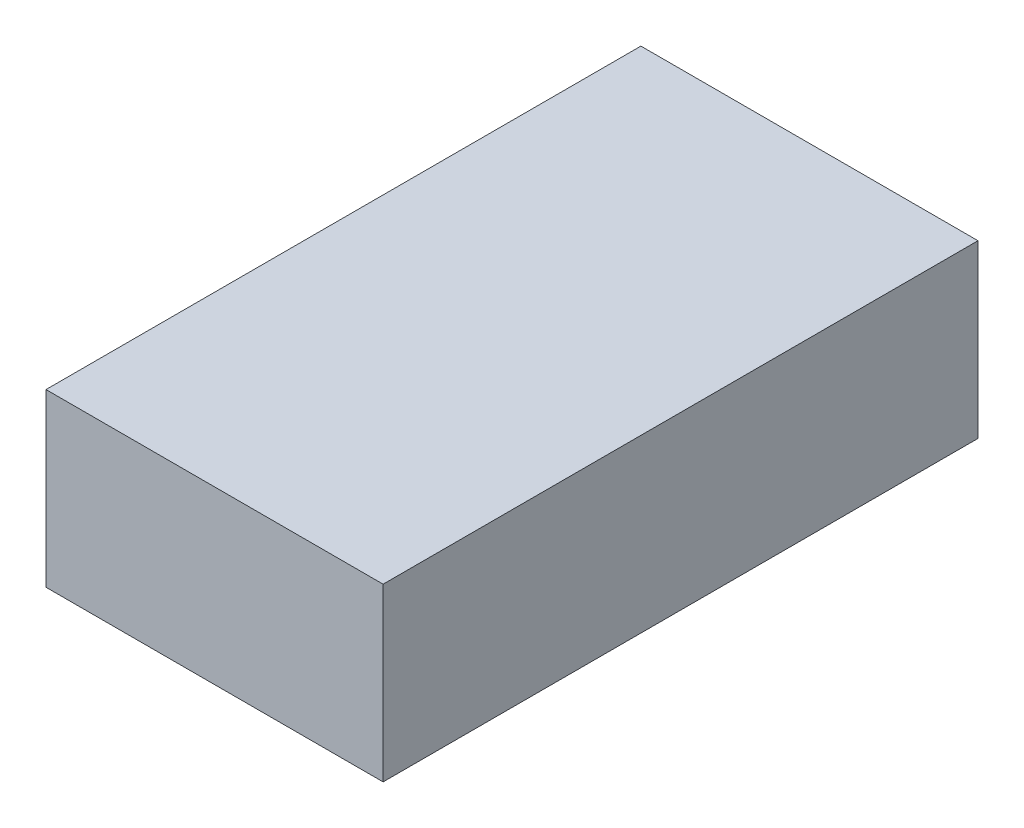
ISO-10303-21;
HEADER;
FILE_DESCRIPTION(('STEP AP214'),'2;1');
FILE_NAME('part.step','',(''),(''),'','','');
FILE_SCHEMA(('AUTOMOTIVE_DESIGN { 1 0 10303 214 1 1 1 1 }'));
ENDSEC;
DATA;
#1=APPLICATION_CONTEXT('core data for automotive mechanical design processes');
#2=APPLICATION_PROTOCOL_DEFINITION('international standard','automotive_design',2000,#1);
#3=PRODUCT_CONTEXT('',#1,'mechanical');
#4=PRODUCT('Part','Part','',(#3));
#5=PRODUCT_RELATED_PRODUCT_CATEGORY('part','',(#4));
#6=PRODUCT_DEFINITION_FORMATION('','',#4);
#7=PRODUCT_DEFINITION_CONTEXT('part definition',#1,'design');
#8=PRODUCT_DEFINITION('design','',#6,#7);
#9=PRODUCT_DEFINITION_SHAPE('','',#8);
#10=(LENGTH_UNIT() NAMED_UNIT(*) SI_UNIT(.MILLI.,.METRE.));
#11=(NAMED_UNIT(*) PLANE_ANGLE_UNIT() SI_UNIT($,.RADIAN.));
#12=(NAMED_UNIT(*) SI_UNIT($,.STERADIAN.) SOLID_ANGLE_UNIT());
#13=UNCERTAINTY_MEASURE_WITH_UNIT(LENGTH_MEASURE(1.E-05),#10,'distance_accuracy_value','');
#14=(GEOMETRIC_REPRESENTATION_CONTEXT(3) GLOBAL_UNCERTAINTY_ASSIGNED_CONTEXT((#13)) GLOBAL_UNIT_ASSIGNED_CONTEXT((#10,
#11,#12)) REPRESENTATION_CONTEXT('',''));
#15=CARTESIAN_POINT('',(0.,0.,0.));
#16=DIRECTION('',(0.,0.,1.));
#17=DIRECTION('',(1.,0.,0.));
#18=AXIS2_PLACEMENT_3D('',#15,#16,#17);
#19=CARTESIAN_POINT('',(42.5,43.18,75.));
#20=DIRECTION('',(-1.,0.,0.));
#21=DIRECTION('',(0.,0.,1.));
#22=AXIS2_PLACEMENT_3D('',#19,#20,#21);
#23=PLANE('',#22);
#24=DIRECTION('',(0.,0.,-1.));
#25=VECTOR('',#24,1.);
#26=CARTESIAN_POINT('',(42.5,0.,75.));
#27=LINE('',#26,#25);
#28=CARTESIAN_POINT('',(42.5,0.,75.));
#29=VERTEX_POINT('',#28);
#30=CARTESIAN_POINT('',(42.5,0.,-75.));
#31=VERTEX_POINT('',#30);
#32=EDGE_CURVE('E96',#29,#31,#27,.T.);
#33=ORIENTED_EDGE('',*,*,#32,.T.);
#34=DIRECTION('',(0.,-1.,0.));
#35=VECTOR('',#34,1.);
#36=CARTESIAN_POINT('',(42.5,43.18,-75.));
#37=LINE('',#36,#35);
#38=CARTESIAN_POINT('',(42.5,43.18,-75.));
#39=VERTEX_POINT('',#38);
#40=EDGE_CURVE('E11',#39,#31,#37,.T.);
#41=ORIENTED_EDGE('',*,*,#40,.F.);
#42=DIRECTION('',(0.,0.,-1.));
#43=VECTOR('',#42,1.);
#44=CARTESIAN_POINT('',(42.5,43.18,75.));
#45=LINE('',#44,#43);
#46=CARTESIAN_POINT('',(42.5,43.18,75.));
#47=VERTEX_POINT('',#46);
#48=EDGE_CURVE('E84',#47,#39,#45,.T.);
#49=ORIENTED_EDGE('',*,*,#48,.F.);
#50=DIRECTION('',(0.,-1.,0.));
#51=VECTOR('',#50,1.);
#52=CARTESIAN_POINT('',(42.5,43.18,75.));
#53=LINE('',#52,#51);
#54=EDGE_CURVE('E92',#47,#29,#53,.T.);
#55=ORIENTED_EDGE('',*,*,#54,.T.);
#56=EDGE_LOOP('',(#33,#41,#49,#55));
#57=FACE_BOUND('',#56,.T.);
#58=ADVANCED_FACE('F33',(#57),#23,.F.);
#59=CARTESIAN_POINT('',(-42.5,43.18,-75.));
#60=DIRECTION('',(0.,0.,1.));
#61=DIRECTION('',(1.,0.,0.));
#62=AXIS2_PLACEMENT_3D('',#59,#60,#61);
#63=PLANE('',#62);
#64=DIRECTION('',(-1.,0.,0.));
#65=VECTOR('',#64,1.);
#66=CARTESIAN_POINT('',(-42.5,0.,-75.));
#67=LINE('',#66,#65);
#68=CARTESIAN_POINT('',(-42.5,0.,-75.));
#69=VERTEX_POINT('',#68);
#70=EDGE_CURVE('E88',#31,#69,#67,.T.);
#71=ORIENTED_EDGE('',*,*,#70,.T.);
#72=DIRECTION('',(0.,-1.,0.));
#73=VECTOR('',#72,1.);
#74=CARTESIAN_POINT('',(-42.5,43.18,-75.));
#75=LINE('',#74,#73);
#76=CARTESIAN_POINT('',(-42.5,43.18,-75.));
#77=VERTEX_POINT('',#76);
#78=EDGE_CURVE('E41',#77,#69,#75,.T.);
#79=ORIENTED_EDGE('',*,*,#78,.F.);
#80=DIRECTION('',(-1.,0.,0.));
#81=VECTOR('',#80,1.);
#82=CARTESIAN_POINT('',(-42.5,43.18,-75.));
#83=LINE('',#82,#81);
#84=EDGE_CURVE('E79',#39,#77,#83,.T.);
#85=ORIENTED_EDGE('',*,*,#84,.F.);
#86=ORIENTED_EDGE('',*,*,#40,.T.);
#87=EDGE_LOOP('',(#71,#79,#85,#86));
#88=FACE_BOUND('',#87,.T.);
#89=ADVANCED_FACE('F87',(#88),#63,.F.);
#90=CARTESIAN_POINT('',(-42.5,43.18,75.));
#91=DIRECTION('',(1.,0.,0.));
#92=DIRECTION('',(0.,0.,-1.));
#93=AXIS2_PLACEMENT_3D('',#90,#91,#92);
#94=PLANE('',#93);
#95=DIRECTION('',(0.,0.,1.));
#96=VECTOR('',#95,1.);
#97=CARTESIAN_POINT('',(-42.5,0.,75.));
#98=LINE('',#97,#96);
#99=CARTESIAN_POINT('',(-42.5,0.,75.));
#100=VERTEX_POINT('',#99);
#101=EDGE_CURVE('E66',#69,#100,#98,.T.);
#102=ORIENTED_EDGE('',*,*,#101,.T.);
#103=DIRECTION('',(0.,-1.,0.));
#104=VECTOR('',#103,1.);
#105=CARTESIAN_POINT('',(-42.5,43.18,75.));
#106=LINE('',#105,#104);
#107=CARTESIAN_POINT('',(-42.5,43.18,75.));
#108=VERTEX_POINT('',#107);
#109=EDGE_CURVE('E89',#108,#100,#106,.T.);
#110=ORIENTED_EDGE('',*,*,#109,.F.);
#111=DIRECTION('',(0.,0.,1.));
#112=VECTOR('',#111,1.);
#113=CARTESIAN_POINT('',(-42.5,43.18,75.));
#114=LINE('',#113,#112);
#115=EDGE_CURVE('E82',#77,#108,#114,.T.);
#116=ORIENTED_EDGE('',*,*,#115,.F.);
#117=ORIENTED_EDGE('',*,*,#78,.T.);
#118=EDGE_LOOP('',(#102,#110,#116,#117));
#119=FACE_BOUND('',#118,.T.);
#120=ADVANCED_FACE('F90',(#119),#94,.F.);
#121=CARTESIAN_POINT('',(-42.5,43.18,75.));
#122=DIRECTION('',(0.,0.,-1.));
#123=DIRECTION('',(-1.,0.,0.));
#124=AXIS2_PLACEMENT_3D('',#121,#122,#123);
#125=PLANE('',#124);
#126=DIRECTION('',(1.,0.,0.));
#127=VECTOR('',#126,1.);
#128=CARTESIAN_POINT('',(-42.5,0.,75.));
#129=LINE('',#128,#127);
#130=EDGE_CURVE('E72',#100,#29,#129,.T.);
#131=ORIENTED_EDGE('',*,*,#130,.T.);
#132=ORIENTED_EDGE('',*,*,#54,.F.);
#133=DIRECTION('',(1.,0.,0.));
#134=VECTOR('',#133,1.);
#135=CARTESIAN_POINT('',(-42.5,43.18,75.));
#136=LINE('',#135,#134);
#137=EDGE_CURVE('E49',#108,#47,#136,.T.);
#138=ORIENTED_EDGE('',*,*,#137,.F.);
#139=ORIENTED_EDGE('',*,*,#109,.T.);
#140=EDGE_LOOP('',(#131,#132,#138,#139));
#141=FACE_BOUND('',#140,.T.);
#142=ADVANCED_FACE('F103',(#141),#125,.F.);
#143=CARTESIAN_POINT('',(42.5,43.18,-75.));
#144=DIRECTION('',(0.,-1.,0.));
#145=DIRECTION('',(0.,0.,-1.));
#146=AXIS2_PLACEMENT_3D('',#143,#144,#145);
#147=PLANE('',#146);
#148=ORIENTED_EDGE('',*,*,#48,.T.);
#149=ORIENTED_EDGE('',*,*,#84,.T.);
#150=ORIENTED_EDGE('',*,*,#115,.T.);
#151=ORIENTED_EDGE('',*,*,#137,.T.);
#152=EDGE_LOOP('',(#148,#149,#150,#151));
#153=FACE_BOUND('',#152,.T.);
#154=ADVANCED_FACE('F80',(#153),#147,.F.);
#155=CARTESIAN_POINT('',(42.5,0.,-75.));
#156=DIRECTION('',(0.,-1.,0.));
#157=DIRECTION('',(0.,0.,-1.));
#158=AXIS2_PLACEMENT_3D('',#155,#156,#157);
#159=PLANE('',#158);
#160=ORIENTED_EDGE('',*,*,#32,.F.);
#161=ORIENTED_EDGE('',*,*,#130,.F.);
#162=ORIENTED_EDGE('',*,*,#101,.F.);
#163=ORIENTED_EDGE('',*,*,#70,.F.);
#164=EDGE_LOOP('',(#160,#161,#162,#163));
#165=FACE_BOUND('',#164,.T.);
#166=ADVANCED_FACE('F106',(#165),#159,.T.);
#167=CLOSED_SHELL('',(#58,#89,#120,#142,#154,#166));
#168=MANIFOLD_SOLID_BREP('B2',#167);
#169=ADVANCED_BREP_SHAPE_REPRESENTATION('',(#18,#168),#14);
#170=SHAPE_DEFINITION_REPRESENTATION(#9,#169);
ENDSEC;
END-ISO-10303-21;
